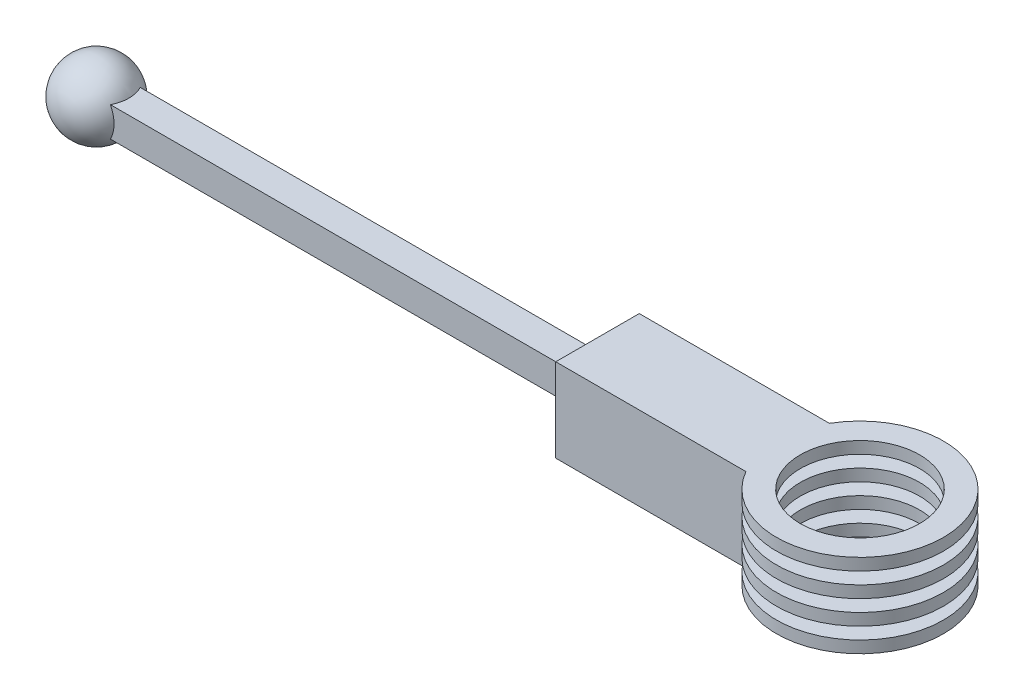
ISO-10303-21;
HEADER;
FILE_DESCRIPTION(('STEP AP214'),'2;1');
FILE_NAME('part.step','',(''),(''),'','','');
FILE_SCHEMA(('AUTOMOTIVE_DESIGN { 1 0 10303 214 1 1 1 1 }'));
ENDSEC;
DATA;
#1=APPLICATION_CONTEXT('core data for automotive mechanical design processes');
#2=APPLICATION_PROTOCOL_DEFINITION('international standard','automotive_design',2000,#1);
#3=PRODUCT_CONTEXT('',#1,'mechanical');
#4=PRODUCT('Part','Part','',(#3));
#5=PRODUCT_RELATED_PRODUCT_CATEGORY('part','',(#4));
#6=PRODUCT_DEFINITION_FORMATION('','',#4);
#7=PRODUCT_DEFINITION_CONTEXT('part definition',#1,'design');
#8=PRODUCT_DEFINITION('design','',#6,#7);
#9=PRODUCT_DEFINITION_SHAPE('','',#8);
#10=(LENGTH_UNIT() NAMED_UNIT(*) SI_UNIT(.MILLI.,.METRE.));
#11=(NAMED_UNIT(*) PLANE_ANGLE_UNIT() SI_UNIT($,.RADIAN.));
#12=(NAMED_UNIT(*) SI_UNIT($,.STERADIAN.) SOLID_ANGLE_UNIT());
#13=UNCERTAINTY_MEASURE_WITH_UNIT(LENGTH_MEASURE(1.E-05),#10,'distance_accuracy_value','');
#14=(GEOMETRIC_REPRESENTATION_CONTEXT(3) GLOBAL_UNCERTAINTY_ASSIGNED_CONTEXT((#13)) GLOBAL_UNIT_ASSIGNED_CONTEXT((#10,
#11,#12)) REPRESENTATION_CONTEXT('',''));
#15=CARTESIAN_POINT('',(0.,0.,0.));
#16=DIRECTION('',(0.,0.,1.));
#17=DIRECTION('',(1.,0.,0.));
#18=AXIS2_PLACEMENT_3D('',#15,#16,#17);
#19=CARTESIAN_POINT('',(1625.6,177.8,-330.2));
#20=DIRECTION('',(-1.,0.,0.));
#21=DIRECTION('',(0.,0.,1.));
#22=AXIS2_PLACEMENT_3D('',#19,#20,#21);
#23=PLANE('',#22);
#24=DIRECTION('',(0.,0.,1.));
#25=VECTOR('',#24,1.);
#26=CARTESIAN_POINT('',(1625.6,177.8,-330.2));
#27=LINE('',#26,#25);
#28=CARTESIAN_POINT('',(1625.6,177.8,-330.2));
#29=VERTEX_POINT('',#28);
#30=CARTESIAN_POINT('',(1625.6,177.8,25.3999999999999));
#31=VERTEX_POINT('',#30);
#32=EDGE_CURVE('E235',#29,#31,#27,.T.);
#33=ORIENTED_EDGE('',*,*,#32,.F.);
#34=DIRECTION('',(0.,1.,0.));
#35=VECTOR('',#34,1.);
#36=CARTESIAN_POINT('',(1625.6,-177.8,-330.2));
#37=LINE('',#36,#35);
#38=CARTESIAN_POINT('',(1625.6,-177.8,-330.2));
#39=VERTEX_POINT('',#38);
#40=EDGE_CURVE('E229',#39,#29,#37,.T.);
#41=ORIENTED_EDGE('',*,*,#40,.F.);
#42=DIRECTION('',(0.,0.,-1.));
#43=VECTOR('',#42,1.);
#44=CARTESIAN_POINT('',(1625.6,-177.8,25.3999999999999));
#45=LINE('',#44,#43);
#46=CARTESIAN_POINT('',(1625.6,-177.8,25.3999999999999));
#47=VERTEX_POINT('',#46);
#48=EDGE_CURVE('E231',#47,#39,#45,.T.);
#49=ORIENTED_EDGE('',*,*,#48,.F.);
#50=DIRECTION('',(0.,-1.,0.));
#51=VECTOR('',#50,1.);
#52=CARTESIAN_POINT('',(1625.6,177.8,25.3999999999999));
#53=LINE('',#52,#51);
#54=EDGE_CURVE('E233',#31,#47,#53,.T.);
#55=ORIENTED_EDGE('',*,*,#54,.F.);
#56=EDGE_LOOP('',(#33,#41,#49,#55));
#57=FACE_BOUND('',#56,.T.);
#58=ADVANCED_FACE('F44',(#57),#23,.T.);
#59=CARTESIAN_POINT('',(2743.2,-177.8,-152.4));
#60=DIRECTION('',(0.,1.,0.));
#61=DIRECTION('',(0.,0.,1.));
#62=AXIS2_PLACEMENT_3D('',#59,#60,#61);
#63=CYLINDRICAL_SURFACE('',#62,254.);
#64=CARTESIAN_POINT('',(2743.2,25.4,-152.4));
#65=DIRECTION('',(0.,1.,0.));
#66=DIRECTION('',(0.,0.,1.));
#67=AXIS2_PLACEMENT_3D('',#64,#65,#66);
#68=CIRCLE('',#67,254.);
#69=CARTESIAN_POINT('',(2743.2,25.4,101.6));
#70=VERTEX_POINT('',#69);
#71=EDGE_CURVE('E180',#70,#70,#68,.F.);
#72=ORIENTED_EDGE('',*,*,#71,.T.);
#73=EDGE_LOOP('',(#72));
#74=FACE_BOUND('',#73,.T.);
#75=CARTESIAN_POINT('',(2743.2,76.2,-152.4));
#76=DIRECTION('',(0.,1.,0.));
#77=DIRECTION('',(0.,0.,1.));
#78=AXIS2_PLACEMENT_3D('',#75,#76,#77);
#79=CIRCLE('',#78,254.);
#80=CARTESIAN_POINT('',(2743.2,76.2,101.6));
#81=VERTEX_POINT('',#80);
#82=EDGE_CURVE('E133',#81,#81,#79,.F.);
#83=ORIENTED_EDGE('',*,*,#82,.F.);
#84=EDGE_LOOP('',(#83));
#85=FACE_BOUND('',#84,.T.);
#86=ADVANCED_FACE('F280',(#74,#85),#63,.F.);
#87=CARTESIAN_POINT('',(2743.2,-76.1999999999999,-152.4));
#88=DIRECTION('',(0.,1.,0.));
#89=DIRECTION('',(0.,0.,1.));
#90=AXIS2_PLACEMENT_3D('',#87,#88,#89);
#91=CIRCLE('',#90,254.);
#92=CARTESIAN_POINT('',(2743.2,-76.1999999999999,101.6));
#93=VERTEX_POINT('',#92);
#94=EDGE_CURVE('E169',#93,#93,#91,.F.);
#95=ORIENTED_EDGE('',*,*,#94,.T.);
#96=EDGE_LOOP('',(#95));
#97=FACE_BOUND('',#96,.T.);
#98=CARTESIAN_POINT('',(2743.2,-25.3999999999999,-152.4));
#99=DIRECTION('',(0.,1.,0.));
#100=DIRECTION('',(0.,0.,1.));
#101=AXIS2_PLACEMENT_3D('',#98,#99,#100);
#102=CIRCLE('',#101,254.);
#103=CARTESIAN_POINT('',(2743.2,-25.3999999999999,101.6));
#104=VERTEX_POINT('',#103);
#105=EDGE_CURVE('E482',#104,#104,#102,.F.);
#106=ORIENTED_EDGE('',*,*,#105,.F.);
#107=EDGE_LOOP('',(#106));
#108=FACE_BOUND('',#107,.T.);
#109=ADVANCED_FACE('F284',(#97,#108),#63,.F.);
#110=CARTESIAN_POINT('',(0.,127.,-152.4));
#111=DIRECTION('',(0.,1.,0.));
#112=DIRECTION('',(0.,0.,1.));
#113=AXIS2_PLACEMENT_3D('',#110,#111,#112);
#114=PLANE('',#113);
#115=CARTESIAN_POINT('',(2743.2,127.,-152.4));
#116=DIRECTION('',(0.,1.,0.));
#117=DIRECTION('',(0.,0.,1.));
#118=AXIS2_PLACEMENT_3D('',#115,#116,#117);
#119=CIRCLE('',#118,355.6);
#120=CARTESIAN_POINT('',(2435.24136641425,127.,-330.2));
#121=VERTEX_POINT('',#120);
#122=CARTESIAN_POINT('',(2435.24136641425,127.,25.4));
#123=VERTEX_POINT('',#122);
#124=EDGE_CURVE('E52',#121,#123,#119,.T.);
#125=ORIENTED_EDGE('',*,*,#124,.F.);
#126=EDGE_CURVE('E12',#123,#121,#119,.T.);
#127=ORIENTED_EDGE('',*,*,#126,.F.);
#128=EDGE_LOOP('',(#125,#127));
#129=FACE_BOUND('',#128,.T.);
#130=CARTESIAN_POINT('',(2743.2,127.,-152.4));
#131=DIRECTION('',(0.,1.,0.));
#132=DIRECTION('',(0.,0.,1.));
#133=AXIS2_PLACEMENT_3D('',#130,#131,#132);
#134=CIRCLE('',#133,254.);
#135=CARTESIAN_POINT('',(2743.2,127.,101.6));
#136=VERTEX_POINT('',#135);
#137=EDGE_CURVE('E485',#136,#136,#134,.F.);
#138=ORIENTED_EDGE('',*,*,#137,.F.);
#139=EDGE_LOOP('',(#138));
#140=FACE_BOUND('',#139,.T.);
#141=ADVANCED_FACE('F290',(#129,#140),#114,.F.);
#142=CARTESIAN_POINT('',(0.,76.2,-152.4));
#143=DIRECTION('',(0.,1.,0.));
#144=DIRECTION('',(0.,0.,1.));
#145=AXIS2_PLACEMENT_3D('',#142,#143,#144);
#146=PLANE('',#145);
#147=CARTESIAN_POINT('',(2743.2,76.2,-152.4));
#148=DIRECTION('',(0.,1.,0.));
#149=DIRECTION('',(0.,0.,1.));
#150=AXIS2_PLACEMENT_3D('',#147,#148,#149);
#151=CIRCLE('',#150,355.6);
#152=CARTESIAN_POINT('',(2435.24136641425,76.2,-330.2));
#153=VERTEX_POINT('',#152);
#154=CARTESIAN_POINT('',(2435.24136641425,76.2,25.4));
#155=VERTEX_POINT('',#154);
#156=EDGE_CURVE('E181',#153,#155,#151,.T.);
#157=ORIENTED_EDGE('',*,*,#156,.T.);
#158=EDGE_CURVE('E182',#155,#153,#151,.T.);
#159=ORIENTED_EDGE('',*,*,#158,.T.);
#160=EDGE_LOOP('',(#157,#159));
#161=FACE_BOUND('',#160,.T.);
#162=ORIENTED_EDGE('',*,*,#82,.T.);
#163=EDGE_LOOP('',(#162));
#164=FACE_BOUND('',#163,.T.);
#165=ADVANCED_FACE('F188',(#161,#164),#146,.T.);
#166=CARTESIAN_POINT('',(0.,25.4,-152.4));
#167=DIRECTION('',(0.,1.,0.));
#168=DIRECTION('',(0.,0.,1.));
#169=AXIS2_PLACEMENT_3D('',#166,#167,#168);
#170=PLANE('',#169);
#171=CARTESIAN_POINT('',(2743.2,25.4,-152.4));
#172=DIRECTION('',(0.,1.,0.));
#173=DIRECTION('',(0.,0.,1.));
#174=AXIS2_PLACEMENT_3D('',#171,#172,#173);
#175=CIRCLE('',#174,355.6);
#176=CARTESIAN_POINT('',(2435.24136641425,25.4,-330.2));
#177=VERTEX_POINT('',#176);
#178=CARTESIAN_POINT('',(2435.24136641425,25.4,25.4));
#179=VERTEX_POINT('',#178);
#180=EDGE_CURVE('E47',#177,#179,#175,.T.);
#181=ORIENTED_EDGE('',*,*,#180,.F.);
#182=EDGE_CURVE('E183',#179,#177,#175,.T.);
#183=ORIENTED_EDGE('',*,*,#182,.F.);
#184=EDGE_LOOP('',(#181,#183));
#185=FACE_BOUND('',#184,.T.);
#186=ORIENTED_EDGE('',*,*,#71,.F.);
#187=EDGE_LOOP('',(#186));
#188=FACE_BOUND('',#187,.T.);
#189=ADVANCED_FACE('F306',(#185,#188),#170,.F.);
#190=CARTESIAN_POINT('',(0.,-25.3999999999999,-152.4));
#191=DIRECTION('',(0.,1.,0.));
#192=DIRECTION('',(0.,0.,1.));
#193=AXIS2_PLACEMENT_3D('',#190,#191,#192);
#194=PLANE('',#193);
#195=CARTESIAN_POINT('',(2743.2,-25.3999999999999,-152.4));
#196=DIRECTION('',(0.,1.,0.));
#197=DIRECTION('',(0.,0.,1.));
#198=AXIS2_PLACEMENT_3D('',#195,#196,#197);
#199=CIRCLE('',#198,355.6);
#200=CARTESIAN_POINT('',(2435.24136641425,-25.3999999999999,-330.2));
#201=VERTEX_POINT('',#200);
#202=CARTESIAN_POINT('',(2435.24136641425,-25.3999999999999,25.4));
#203=VERTEX_POINT('',#202);
#204=EDGE_CURVE('E121',#201,#203,#199,.T.);
#205=ORIENTED_EDGE('',*,*,#204,.T.);
#206=EDGE_CURVE('E132',#203,#201,#199,.T.);
#207=ORIENTED_EDGE('',*,*,#206,.T.);
#208=EDGE_LOOP('',(#205,#207));
#209=FACE_BOUND('',#208,.T.);
#210=ORIENTED_EDGE('',*,*,#105,.T.);
#211=EDGE_LOOP('',(#210));
#212=FACE_BOUND('',#211,.T.);
#213=ADVANCED_FACE('F135',(#209,#212),#194,.T.);
#214=CARTESIAN_POINT('',(0.,-76.1999999999999,-152.4));
#215=DIRECTION('',(0.,1.,0.));
#216=DIRECTION('',(0.,0.,1.));
#217=AXIS2_PLACEMENT_3D('',#214,#215,#216);
#218=PLANE('',#217);
#219=CARTESIAN_POINT('',(2743.2,-76.1999999999999,-152.4));
#220=DIRECTION('',(0.,1.,0.));
#221=DIRECTION('',(0.,0.,1.));
#222=AXIS2_PLACEMENT_3D('',#219,#220,#221);
#223=CIRCLE('',#222,355.6);
#224=CARTESIAN_POINT('',(2435.24136641425,-76.1999999999999,-330.2));
#225=VERTEX_POINT('',#224);
#226=CARTESIAN_POINT('',(2435.24136641425,-76.1999999999999,25.4));
#227=VERTEX_POINT('',#226);
#228=EDGE_CURVE('E175',#225,#227,#223,.T.);
#229=ORIENTED_EDGE('',*,*,#228,.F.);
#230=EDGE_CURVE('E143',#227,#225,#223,.T.);
#231=ORIENTED_EDGE('',*,*,#230,.F.);
#232=EDGE_LOOP('',(#229,#231));
#233=FACE_BOUND('',#232,.T.);
#234=ORIENTED_EDGE('',*,*,#94,.F.);
#235=EDGE_LOOP('',(#234));
#236=FACE_BOUND('',#235,.T.);
#237=ADVANCED_FACE('F204',(#233,#236),#218,.F.);
#238=CARTESIAN_POINT('',(0.,-127.,-152.4));
#239=DIRECTION('',(0.,1.,0.));
#240=DIRECTION('',(0.,0.,1.));
#241=AXIS2_PLACEMENT_3D('',#238,#239,#240);
#242=PLANE('',#241);
#243=CARTESIAN_POINT('',(2743.2,-127.,-152.4));
#244=DIRECTION('',(0.,1.,0.));
#245=DIRECTION('',(0.,0.,1.));
#246=AXIS2_PLACEMENT_3D('',#243,#244,#245);
#247=CIRCLE('',#246,355.6);
#248=CARTESIAN_POINT('',(2435.24136641425,-127.,-330.2));
#249=VERTEX_POINT('',#248);
#250=CARTESIAN_POINT('',(2435.24136641425,-127.,25.4));
#251=VERTEX_POINT('',#250);
#252=EDGE_CURVE('E170',#249,#251,#247,.T.);
#253=ORIENTED_EDGE('',*,*,#252,.T.);
#254=EDGE_CURVE('E173',#251,#249,#247,.T.);
#255=ORIENTED_EDGE('',*,*,#254,.T.);
#256=EDGE_LOOP('',(#253,#255));
#257=FACE_BOUND('',#256,.T.);
#258=CARTESIAN_POINT('',(2743.2,-127.,-152.4));
#259=DIRECTION('',(0.,1.,0.));
#260=DIRECTION('',(0.,0.,1.));
#261=AXIS2_PLACEMENT_3D('',#258,#259,#260);
#262=CIRCLE('',#261,254.);
#263=CARTESIAN_POINT('',(2743.2,-127.,101.6));
#264=VERTEX_POINT('',#263);
#265=EDGE_CURVE('E174',#264,#264,#262,.F.);
#266=ORIENTED_EDGE('',*,*,#265,.T.);
#267=EDGE_LOOP('',(#266));
#268=FACE_BOUND('',#267,.T.);
#269=ADVANCED_FACE('F207',(#257,#268),#242,.T.);
#270=ORIENTED_EDGE('',*,*,#137,.T.);
#271=EDGE_LOOP('',(#270));
#272=FACE_BOUND('',#271,.T.);
#273=CARTESIAN_POINT('',(2743.2,177.8,-152.4));
#274=DIRECTION('',(0.,1.,0.));
#275=DIRECTION('',(0.,0.,1.));
#276=AXIS2_PLACEMENT_3D('',#273,#274,#275);
#277=CIRCLE('',#276,254.);
#278=CARTESIAN_POINT('',(2743.2,177.8,101.6));
#279=VERTEX_POINT('',#278);
#280=EDGE_CURVE('E160',#279,#279,#277,.T.);
#281=ORIENTED_EDGE('',*,*,#280,.T.);
#282=EDGE_LOOP('',(#281));
#283=FACE_BOUND('',#282,.T.);
#284=ADVANCED_FACE('F279',(#272,#283),#63,.F.);
#285=CARTESIAN_POINT('',(2387.6,-177.8,-330.2));
#286=DIRECTION('',(0.,0.,1.));
#287=DIRECTION('',(0.,-1.,0.));
#288=AXIS2_PLACEMENT_3D('',#285,#286,#287);
#289=PLANE('',#288);
#290=ORIENTED_EDGE('',*,*,#40,.T.);
#291=DIRECTION('',(-1.,0.,0.));
#292=VECTOR('',#291,1.);
#293=CARTESIAN_POINT('',(2387.6,177.8,-330.2));
#294=LINE('',#293,#292);
#295=CARTESIAN_POINT('',(2435.24136641425,177.8,-330.2));
#296=VERTEX_POINT('',#295);
#297=EDGE_CURVE('E226',#296,#29,#294,.T.);
#298=ORIENTED_EDGE('',*,*,#297,.F.);
#299=DIRECTION('',(0.,1.,0.));
#300=VECTOR('',#299,1.);
#301=CARTESIAN_POINT('',(2435.24136641425,-177.8,-330.2));
#302=LINE('',#301,#300);
#303=EDGE_CURVE('E149',#296,#121,#302,.F.);
#304=ORIENTED_EDGE('',*,*,#303,.T.);
#305=EDGE_CURVE('E65',#121,#153,#302,.F.);
#306=ORIENTED_EDGE('',*,*,#305,.T.);
#307=EDGE_CURVE('E153',#153,#177,#302,.F.);
#308=ORIENTED_EDGE('',*,*,#307,.T.);
#309=EDGE_CURVE('E126',#177,#201,#302,.F.);
#310=ORIENTED_EDGE('',*,*,#309,.T.);
#311=EDGE_CURVE('E141',#201,#225,#302,.F.);
#312=ORIENTED_EDGE('',*,*,#311,.T.);
#313=EDGE_CURVE('E147',#225,#249,#302,.F.);
#314=ORIENTED_EDGE('',*,*,#313,.T.);
#315=CARTESIAN_POINT('',(2435.24136641425,-177.8,-330.2));
#316=VERTEX_POINT('',#315);
#317=EDGE_CURVE('E167',#249,#316,#302,.F.);
#318=ORIENTED_EDGE('',*,*,#317,.T.);
#319=DIRECTION('',(-1.,0.,0.));
#320=VECTOR('',#319,1.);
#321=CARTESIAN_POINT('',(2387.6,-177.8,-330.2));
#322=LINE('',#321,#320);
#323=EDGE_CURVE('E224',#316,#39,#322,.T.);
#324=ORIENTED_EDGE('',*,*,#323,.T.);
#325=EDGE_LOOP('',(#290,#298,#304,#306,#308,#310,#312,#314,#318,#324));
#326=FACE_BOUND('',#325,.T.);
#327=ADVANCED_FACE('F151',(#326),#289,.F.);
#328=CARTESIAN_POINT('',(2743.2,-177.8,-152.4));
#329=DIRECTION('',(0.,1.,0.));
#330=DIRECTION('',(0.,0.,1.));
#331=AXIS2_PLACEMENT_3D('',#328,#329,#330);
#332=CIRCLE('',#331,254.);
#333=CARTESIAN_POINT('',(2743.2,-177.8,101.6));
#334=VERTEX_POINT('',#333);
#335=EDGE_CURVE('E164',#334,#334,#332,.T.);
#336=ORIENTED_EDGE('',*,*,#335,.F.);
#337=EDGE_LOOP('',(#336));
#338=FACE_BOUND('',#337,.T.);
#339=ORIENTED_EDGE('',*,*,#265,.F.);
#340=EDGE_LOOP('',(#339));
#341=FACE_BOUND('',#340,.T.);
#342=ADVANCED_FACE('F267',(#338,#341),#63,.F.);
#343=CARTESIAN_POINT('',(2387.6,177.8,-330.2));
#344=DIRECTION('',(0.,-1.,0.));
#345=DIRECTION('',(0.,0.,-1.));
#346=AXIS2_PLACEMENT_3D('',#343,#344,#345);
#347=PLANE('',#346);
#348=ORIENTED_EDGE('',*,*,#280,.F.);
#349=EDGE_LOOP('',(#348));
#350=FACE_BOUND('',#349,.T.);
#351=ORIENTED_EDGE('',*,*,#32,.T.);
#352=DIRECTION('',(-1.,0.,0.));
#353=VECTOR('',#352,1.);
#354=CARTESIAN_POINT('',(2387.6,177.8,25.3999999999999));
#355=LINE('',#354,#353);
#356=CARTESIAN_POINT('',(2435.24136641425,177.8,25.3999999999998));
#357=VERTEX_POINT('',#356);
#358=EDGE_CURVE('E218',#357,#31,#355,.T.);
#359=ORIENTED_EDGE('',*,*,#358,.F.);
#360=CARTESIAN_POINT('',(2743.2,177.8,-152.4));
#361=DIRECTION('',(0.,1.,0.));
#362=DIRECTION('',(0.,0.,1.));
#363=AXIS2_PLACEMENT_3D('',#360,#361,#362);
#364=CIRCLE('',#363,355.6);
#365=EDGE_CURVE('E157',#357,#296,#364,.T.);
#366=ORIENTED_EDGE('',*,*,#365,.T.);
#367=ORIENTED_EDGE('',*,*,#297,.T.);
#368=EDGE_LOOP('',(#351,#359,#366,#367));
#369=FACE_BOUND('',#368,.T.);
#370=ADVANCED_FACE('F264',(#350,#369),#347,.F.);
#371=CARTESIAN_POINT('',(2743.2,-177.8,-152.4));
#372=DIRECTION('',(0.,1.,0.));
#373=DIRECTION('',(0.,0.,1.));
#374=AXIS2_PLACEMENT_3D('',#371,#372,#373);
#375=CYLINDRICAL_SURFACE('',#374,355.6);
#376=ORIENTED_EDGE('',*,*,#126,.T.);
#377=ORIENTED_EDGE('',*,*,#303,.F.);
#378=ORIENTED_EDGE('',*,*,#365,.F.);
#379=DIRECTION('',(0.,1.,0.));
#380=VECTOR('',#379,1.);
#381=CARTESIAN_POINT('',(2435.24136641425,-177.8,25.3999999999999));
#382=LINE('',#381,#380);
#383=EDGE_CURVE('E241',#123,#357,#382,.T.);
#384=ORIENTED_EDGE('',*,*,#383,.F.);
#385=EDGE_LOOP('',(#376,#377,#378,#384));
#386=FACE_BOUND('',#385,.T.);
#387=ADVANCED_FACE('F266',(#386),#375,.T.);
#388=CARTESIAN_POINT('',(2743.2,177.8,-152.4));
#389=DIRECTION('',(0.,1.,0.));
#390=DIRECTION('',(0.,0.,1.));
#391=AXIS2_PLACEMENT_3D('',#388,#389,#390);
#392=CYLINDRICAL_SURFACE('',#391,355.6);
#393=DIRECTION('',(0.,1.,0.));
#394=VECTOR('',#393,1.);
#395=CARTESIAN_POINT('',(2435.24136641425,177.8,25.3999999999999));
#396=LINE('',#395,#394);
#397=EDGE_CURVE('E60',#123,#155,#396,.F.);
#398=ORIENTED_EDGE('',*,*,#397,.T.);
#399=ORIENTED_EDGE('',*,*,#156,.F.);
#400=ORIENTED_EDGE('',*,*,#305,.F.);
#401=ORIENTED_EDGE('',*,*,#124,.T.);
#402=EDGE_LOOP('',(#398,#399,#400,#401));
#403=FACE_BOUND('',#402,.T.);
#404=ADVANCED_FACE('F274',(#403),#392,.F.);
#405=ORIENTED_EDGE('',*,*,#182,.T.);
#406=ORIENTED_EDGE('',*,*,#307,.F.);
#407=ORIENTED_EDGE('',*,*,#158,.F.);
#408=EDGE_CURVE('E249',#179,#155,#382,.T.);
#409=ORIENTED_EDGE('',*,*,#408,.F.);
#410=EDGE_LOOP('',(#405,#406,#407,#409));
#411=FACE_BOUND('',#410,.T.);
#412=ADVANCED_FACE('F194',(#411),#375,.T.);
#413=CARTESIAN_POINT('',(2743.2,177.8,-152.4));
#414=DIRECTION('',(0.,1.,0.));
#415=DIRECTION('',(0.,0.,1.));
#416=AXIS2_PLACEMENT_3D('',#413,#414,#415);
#417=CYLINDRICAL_SURFACE('',#416,355.6);
#418=DIRECTION('',(0.,1.,0.));
#419=VECTOR('',#418,1.);
#420=CARTESIAN_POINT('',(2435.24136641425,177.8,25.3999999999999));
#421=LINE('',#420,#419);
#422=EDGE_CURVE('E129',#179,#203,#421,.F.);
#423=ORIENTED_EDGE('',*,*,#422,.T.);
#424=ORIENTED_EDGE('',*,*,#204,.F.);
#425=ORIENTED_EDGE('',*,*,#309,.F.);
#426=ORIENTED_EDGE('',*,*,#180,.T.);
#427=EDGE_LOOP('',(#423,#424,#425,#426));
#428=FACE_BOUND('',#427,.T.);
#429=ADVANCED_FACE('F123',(#428),#417,.F.);
#430=ORIENTED_EDGE('',*,*,#311,.F.);
#431=ORIENTED_EDGE('',*,*,#206,.F.);
#432=EDGE_CURVE('E240',#227,#203,#382,.T.);
#433=ORIENTED_EDGE('',*,*,#432,.F.);
#434=ORIENTED_EDGE('',*,*,#230,.T.);
#435=EDGE_LOOP('',(#430,#431,#433,#434));
#436=FACE_BOUND('',#435,.T.);
#437=ADVANCED_FACE('F142',(#436),#375,.T.);
#438=CARTESIAN_POINT('',(2743.2,177.8,-152.4));
#439=DIRECTION('',(0.,1.,0.));
#440=DIRECTION('',(0.,0.,1.));
#441=AXIS2_PLACEMENT_3D('',#438,#439,#440);
#442=CYLINDRICAL_SURFACE('',#441,355.6);
#443=DIRECTION('',(0.,1.,0.));
#444=VECTOR('',#443,1.);
#445=CARTESIAN_POINT('',(2435.24136641425,177.8,25.3999999999999));
#446=LINE('',#445,#444);
#447=EDGE_CURVE('E163',#227,#251,#446,.F.);
#448=ORIENTED_EDGE('',*,*,#447,.T.);
#449=ORIENTED_EDGE('',*,*,#252,.F.);
#450=ORIENTED_EDGE('',*,*,#313,.F.);
#451=ORIENTED_EDGE('',*,*,#228,.T.);
#452=EDGE_LOOP('',(#448,#449,#450,#451));
#453=FACE_BOUND('',#452,.T.);
#454=ADVANCED_FACE('F201',(#453),#442,.F.);
#455=ORIENTED_EDGE('',*,*,#317,.F.);
#456=ORIENTED_EDGE('',*,*,#254,.F.);
#457=CARTESIAN_POINT('',(2435.24136641425,-177.8,25.3999999999997));
#458=VERTEX_POINT('',#457);
#459=EDGE_CURVE('E238',#458,#251,#382,.T.);
#460=ORIENTED_EDGE('',*,*,#459,.F.);
#461=CARTESIAN_POINT('',(2743.2,-177.8,-152.4));
#462=DIRECTION('',(0.,1.,0.));
#463=DIRECTION('',(0.,0.,1.));
#464=AXIS2_PLACEMENT_3D('',#461,#462,#463);
#465=CIRCLE('',#464,355.6);
#466=EDGE_CURVE('E158',#458,#316,#465,.T.);
#467=ORIENTED_EDGE('',*,*,#466,.T.);
#468=EDGE_LOOP('',(#455,#456,#460,#467));
#469=FACE_BOUND('',#468,.T.);
#470=ADVANCED_FACE('F257',(#469),#375,.T.);
#471=CARTESIAN_POINT('',(2387.6,-177.8,25.3999999999999));
#472=DIRECTION('',(0.,1.,0.));
#473=DIRECTION('',(0.,0.,1.));
#474=AXIS2_PLACEMENT_3D('',#471,#472,#473);
#475=PLANE('',#474);
#476=ORIENTED_EDGE('',*,*,#335,.T.);
#477=EDGE_LOOP('',(#476));
#478=FACE_BOUND('',#477,.T.);
#479=ORIENTED_EDGE('',*,*,#323,.F.);
#480=ORIENTED_EDGE('',*,*,#466,.F.);
#481=DIRECTION('',(-1.,0.,0.));
#482=VECTOR('',#481,1.);
#483=CARTESIAN_POINT('',(2387.6,-177.8,25.3999999999999));
#484=LINE('',#483,#482);
#485=EDGE_CURVE('E221',#458,#47,#484,.T.);
#486=ORIENTED_EDGE('',*,*,#485,.T.);
#487=ORIENTED_EDGE('',*,*,#48,.T.);
#488=EDGE_LOOP('',(#479,#480,#486,#487));
#489=FACE_BOUND('',#488,.T.);
#490=ADVANCED_FACE('F259',(#478,#489),#475,.F.);
#491=CARTESIAN_POINT('',(2387.6,177.8,25.3999999999999));
#492=DIRECTION('',(0.,0.,-1.));
#493=DIRECTION('',(0.,1.,0.));
#494=AXIS2_PLACEMENT_3D('',#491,#492,#493);
#495=PLANE('',#494);
#496=ORIENTED_EDGE('',*,*,#54,.T.);
#497=ORIENTED_EDGE('',*,*,#485,.F.);
#498=ORIENTED_EDGE('',*,*,#459,.T.);
#499=ORIENTED_EDGE('',*,*,#447,.F.);
#500=ORIENTED_EDGE('',*,*,#432,.T.);
#501=ORIENTED_EDGE('',*,*,#422,.F.);
#502=ORIENTED_EDGE('',*,*,#408,.T.);
#503=ORIENTED_EDGE('',*,*,#397,.F.);
#504=ORIENTED_EDGE('',*,*,#383,.T.);
#505=ORIENTED_EDGE('',*,*,#358,.T.);
#506=EDGE_LOOP('',(#496,#497,#498,#499,#500,#501,#502,#503,#504,#505));
#507=FACE_BOUND('',#506,.T.);
#508=ADVANCED_FACE('F252',(#507),#495,.F.);
#509=CLOSED_SHELL('',(#58,#86,#109,#141,#165,#189,#213,#237,#269,#284,#327,#342,#370,#387,#404,
#412,#429,#437,#454,#470,#490,#508));
#510=MANIFOLD_SOLID_BREP('B2',#509);
#511=CARTESIAN_POINT('',(1625.6,177.8,-330.2));
#512=DIRECTION('',(-1.,0.,0.));
#513=DIRECTION('',(0.,0.,1.));
#514=AXIS2_PLACEMENT_3D('',#511,#512,#513);
#515=PLANE('',#514);
#516=DIRECTION('',(0.,0.,1.));
#517=VECTOR('',#516,1.);
#518=CARTESIAN_POINT('',(1625.6,63.5,-215.9));
#519=LINE('',#518,#517);
#520=CARTESIAN_POINT('',(1625.6,63.5,-215.9));
#521=VERTEX_POINT('',#520);
#522=CARTESIAN_POINT('',(1625.6,63.5,-88.9));
#523=VERTEX_POINT('',#522);
#524=EDGE_CURVE('E42',#521,#523,#519,.T.);
#525=ORIENTED_EDGE('',*,*,#524,.T.);
#526=DIRECTION('',(0.,-1.,0.));
#527=VECTOR('',#526,1.);
#528=CARTESIAN_POINT('',(1625.6,63.5,-88.9));
#529=LINE('',#528,#527);
#530=CARTESIAN_POINT('',(1625.6,-63.5,-88.9));
#531=VERTEX_POINT('',#530);
#532=EDGE_CURVE('E505',#523,#531,#529,.T.);
#533=ORIENTED_EDGE('',*,*,#532,.T.);
#534=DIRECTION('',(0.,0.,-1.));
#535=VECTOR('',#534,1.);
#536=CARTESIAN_POINT('',(1625.6,-63.5,-88.9));
#537=LINE('',#536,#535);
#538=CARTESIAN_POINT('',(1625.6,-63.5,-215.9));
#539=VERTEX_POINT('',#538);
#540=EDGE_CURVE('E513',#531,#539,#537,.T.);
#541=ORIENTED_EDGE('',*,*,#540,.T.);
#542=DIRECTION('',(0.,1.,0.));
#543=VECTOR('',#542,1.);
#544=CARTESIAN_POINT('',(1625.6,-63.5,-215.9));
#545=LINE('',#544,#543);
#546=EDGE_CURVE('E555',#539,#521,#545,.T.);
#547=ORIENTED_EDGE('',*,*,#546,.T.);
#548=EDGE_LOOP('',(#525,#533,#541,#547));
#549=FACE_BOUND('',#548,.T.);
#550=ADVANCED_FACE('F497',(#549),#515,.F.);
#551=CARTESIAN_POINT('',(-508.,0.,-152.4));
#552=DIRECTION('',(0.,0.,1.));
#553=DIRECTION('',(-1.,0.,0.));
#554=AXIS2_PLACEMENT_3D('',#551,#552,#553);
#555=SPHERICAL_SURFACE('',#554,152.4);
#556=CARTESIAN_POINT('',(-508.,63.5,-152.4));
#557=DIRECTION('',(0.,1.,0.));
#558=DIRECTION('',(0.,0.,1.));
#559=AXIS2_PLACEMENT_3D('',#556,#557,#558);
#560=CIRCLE('',#559,138.540643855874);
#561=CARTESIAN_POINT('',(-384.868931621625,63.5,-88.9));
#562=VERTEX_POINT('',#561);
#563=CARTESIAN_POINT('',(-384.868931621625,63.5,-215.9));
#564=VERTEX_POINT('',#563);
#565=EDGE_CURVE('E500',#562,#564,#560,.T.);
#566=ORIENTED_EDGE('',*,*,#565,.T.);
#567=CARTESIAN_POINT('',(-508.,0.,-215.9));
#568=DIRECTION('',(0.,0.,-1.));
#569=DIRECTION('',(-1.,0.,0.));
#570=AXIS2_PLACEMENT_3D('',#567,#568,#569);
#571=CIRCLE('',#570,138.540643855874);
#572=CARTESIAN_POINT('',(-384.868931621625,-63.5,-215.9));
#573=VERTEX_POINT('',#572);
#574=EDGE_CURVE('E545',#564,#573,#571,.T.);
#575=ORIENTED_EDGE('',*,*,#574,.T.);
#576=CARTESIAN_POINT('',(-508.,-63.5,-152.4));
#577=DIRECTION('',(0.,-1.,0.));
#578=DIRECTION('',(0.,0.,-1.));
#579=AXIS2_PLACEMENT_3D('',#576,#577,#578);
#580=CIRCLE('',#579,138.540643855874);
#581=CARTESIAN_POINT('',(-384.868931621625,-63.5,-88.9));
#582=VERTEX_POINT('',#581);
#583=EDGE_CURVE('E539',#573,#582,#580,.T.);
#584=ORIENTED_EDGE('',*,*,#583,.T.);
#585=CARTESIAN_POINT('',(-508.,0.,-88.9));
#586=DIRECTION('',(0.,0.,1.));
#587=DIRECTION('',(0.,-1.,0.));
#588=AXIS2_PLACEMENT_3D('',#585,#586,#587);
#589=CIRCLE('',#588,138.540643855874);
#590=EDGE_CURVE('E542',#582,#562,#589,.T.);
#591=ORIENTED_EDGE('',*,*,#590,.T.);
#592=EDGE_LOOP('',(#566,#575,#584,#591));
#593=FACE_BOUND('',#592,.T.);
#594=ADVANCED_FACE('F540',(#593),#555,.T.);
#595=CARTESIAN_POINT('',(-660.401,63.5,-215.9));
#596=DIRECTION('',(0.,1.,0.));
#597=DIRECTION('',(0.,0.,1.));
#598=AXIS2_PLACEMENT_3D('',#595,#596,#597);
#599=PLANE('',#598);
#600=ORIENTED_EDGE('',*,*,#565,.F.);
#601=DIRECTION('',(1.,0.,0.));
#602=VECTOR('',#601,1.);
#603=CARTESIAN_POINT('',(-660.401,63.5,-88.9));
#604=LINE('',#603,#602);
#605=EDGE_CURVE('E554',#562,#523,#604,.T.);
#606=ORIENTED_EDGE('',*,*,#605,.T.);
#607=ORIENTED_EDGE('',*,*,#524,.F.);
#608=DIRECTION('',(1.,0.,0.));
#609=VECTOR('',#608,1.);
#610=CARTESIAN_POINT('',(-660.401,63.5,-215.9));
#611=LINE('',#610,#609);
#612=EDGE_CURVE('E564',#564,#521,#611,.T.);
#613=ORIENTED_EDGE('',*,*,#612,.F.);
#614=EDGE_LOOP('',(#600,#606,#607,#613));
#615=FACE_BOUND('',#614,.T.);
#616=ADVANCED_FACE('F566',(#615),#599,.T.);
#617=CARTESIAN_POINT('',(-660.401,-63.5,-215.9));
#618=DIRECTION('',(0.,0.,-1.));
#619=DIRECTION('',(-1.,0.,0.));
#620=AXIS2_PLACEMENT_3D('',#617,#618,#619);
#621=PLANE('',#620);
#622=ORIENTED_EDGE('',*,*,#574,.F.);
#623=ORIENTED_EDGE('',*,*,#612,.T.);
#624=ORIENTED_EDGE('',*,*,#546,.F.);
#625=DIRECTION('',(1.,0.,0.));
#626=VECTOR('',#625,1.);
#627=CARTESIAN_POINT('',(-660.401,-63.5,-215.9));
#628=LINE('',#627,#626);
#629=EDGE_CURVE('E550',#573,#539,#628,.T.);
#630=ORIENTED_EDGE('',*,*,#629,.F.);
#631=EDGE_LOOP('',(#622,#623,#624,#630));
#632=FACE_BOUND('',#631,.T.);
#633=ADVANCED_FACE('F563',(#632),#621,.T.);
#634=CARTESIAN_POINT('',(-660.401,-63.5,-88.9));
#635=DIRECTION('',(0.,-1.,0.));
#636=DIRECTION('',(0.,0.,-1.));
#637=AXIS2_PLACEMENT_3D('',#634,#635,#636);
#638=PLANE('',#637);
#639=ORIENTED_EDGE('',*,*,#583,.F.);
#640=ORIENTED_EDGE('',*,*,#629,.T.);
#641=ORIENTED_EDGE('',*,*,#540,.F.);
#642=DIRECTION('',(1.,0.,0.));
#643=VECTOR('',#642,1.);
#644=CARTESIAN_POINT('',(-660.401,-63.5,-88.9));
#645=LINE('',#644,#643);
#646=EDGE_CURVE('E548',#582,#531,#645,.T.);
#647=ORIENTED_EDGE('',*,*,#646,.F.);
#648=EDGE_LOOP('',(#639,#640,#641,#647));
#649=FACE_BOUND('',#648,.T.);
#650=ADVANCED_FACE('F549',(#649),#638,.T.);
#651=CARTESIAN_POINT('',(-660.401,63.5,-88.9));
#652=DIRECTION('',(0.,0.,1.));
#653=DIRECTION('',(0.,-1.,0.));
#654=AXIS2_PLACEMENT_3D('',#651,#652,#653);
#655=PLANE('',#654);
#656=ORIENTED_EDGE('',*,*,#590,.F.);
#657=ORIENTED_EDGE('',*,*,#646,.T.);
#658=ORIENTED_EDGE('',*,*,#532,.F.);
#659=ORIENTED_EDGE('',*,*,#605,.F.);
#660=EDGE_LOOP('',(#656,#657,#658,#659));
#661=FACE_BOUND('',#660,.T.);
#662=ADVANCED_FACE('F552',(#661),#655,.T.);
#663=CLOSED_SHELL('',(#550,#594,#616,#633,#650,#662));
#664=MANIFOLD_SOLID_BREP('B6',#663);
#665=ADVANCED_BREP_SHAPE_REPRESENTATION('',(#18,#510,#664),#14);
#666=SHAPE_DEFINITION_REPRESENTATION(#9,#665);
ENDSEC;
END-ISO-10303-21;
